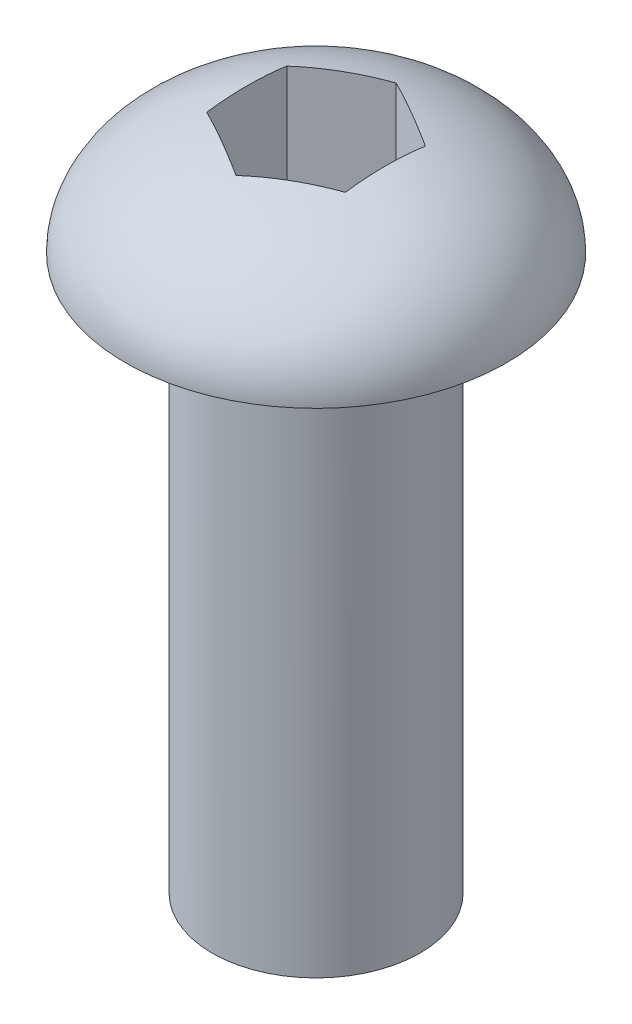
ISO-10303-21;
HEADER;
FILE_DESCRIPTION(('STEP AP214'),'2;1');
FILE_NAME('part.step','',(''),(''),'','','');
FILE_SCHEMA(('AUTOMOTIVE_DESIGN { 1 0 10303 214 1 1 1 1 }'));
ENDSEC;
DATA;
#1=APPLICATION_CONTEXT('core data for automotive mechanical design processes');
#2=APPLICATION_PROTOCOL_DEFINITION('international standard','automotive_design',2000,#1);
#3=PRODUCT_CONTEXT('',#1,'mechanical');
#4=PRODUCT('Part','Part','',(#3));
#5=PRODUCT_RELATED_PRODUCT_CATEGORY('part','',(#4));
#6=PRODUCT_DEFINITION_FORMATION('','',#4);
#7=PRODUCT_DEFINITION_CONTEXT('part definition',#1,'design');
#8=PRODUCT_DEFINITION('design','',#6,#7);
#9=PRODUCT_DEFINITION_SHAPE('','',#8);
#10=(LENGTH_UNIT() NAMED_UNIT(*) SI_UNIT(.MILLI.,.METRE.));
#11=(NAMED_UNIT(*) PLANE_ANGLE_UNIT() SI_UNIT($,.RADIAN.));
#12=(NAMED_UNIT(*) SI_UNIT($,.STERADIAN.) SOLID_ANGLE_UNIT());
#13=UNCERTAINTY_MEASURE_WITH_UNIT(LENGTH_MEASURE(1.E-05),#10,'distance_accuracy_value','');
#14=(GEOMETRIC_REPRESENTATION_CONTEXT(3) GLOBAL_UNCERTAINTY_ASSIGNED_CONTEXT((#13)) GLOBAL_UNIT_ASSIGNED_CONTEXT((#10,
#11,#12)) REPRESENTATION_CONTEXT('',''));
#15=CARTESIAN_POINT('',(0.,0.,0.));
#16=DIRECTION('',(0.,0.,1.));
#17=DIRECTION('',(1.,0.,0.));
#18=AXIS2_PLACEMENT_3D('',#15,#16,#17);
#19=CARTESIAN_POINT('',(0.,8.,0.));
#20=DIRECTION('',(0.,-1.,0.));
#21=DIRECTION('',(0.,0.,-1.));
#22=AXIS2_PLACEMENT_3D('',#19,#20,#21);
#23=CYLINDRICAL_SURFACE('',#22,1.5);
#24=CARTESIAN_POINT('',(0.,0.,0.));
#25=DIRECTION('',(0.,1.,0.));
#26=DIRECTION('',(0.,0.,1.));
#27=AXIS2_PLACEMENT_3D('',#24,#25,#26);
#28=CIRCLE('',#27,1.5);
#29=CARTESIAN_POINT('',(0.,0.,1.5));
#30=VERTEX_POINT('',#29);
#31=EDGE_CURVE('E137',#30,#30,#28,.T.);
#32=ORIENTED_EDGE('',*,*,#31,.T.);
#33=EDGE_LOOP('',(#32));
#34=FACE_BOUND('',#33,.T.);
#35=CARTESIAN_POINT('',(0.,8.,0.));
#36=DIRECTION('',(0.,-1.,0.));
#37=DIRECTION('',(0.,0.,-1.));
#38=AXIS2_PLACEMENT_3D('',#35,#36,#37);
#39=CIRCLE('',#38,1.5);
#40=CARTESIAN_POINT('',(0.,8.,-1.5));
#41=VERTEX_POINT('',#40);
#42=EDGE_CURVE('E122',#41,#41,#39,.T.);
#43=ORIENTED_EDGE('',*,*,#42,.T.);
#44=EDGE_LOOP('',(#43));
#45=FACE_BOUND('',#44,.T.);
#46=ADVANCED_FACE('F32',(#34,#45),#23,.T.);
#47=CARTESIAN_POINT('',(0.,0.,0.));
#48=DIRECTION('',(0.,1.,0.));
#49=DIRECTION('',(0.,0.,1.));
#50=AXIS2_PLACEMENT_3D('',#47,#48,#49);
#51=PLANE('',#50);
#52=ORIENTED_EDGE('',*,*,#31,.F.);
#53=EDGE_LOOP('',(#52));
#54=FACE_BOUND('',#53,.T.);
#55=ADVANCED_FACE('F167',(#54),#51,.F.);
#56=CARTESIAN_POINT('',(0.,8.,0.));
#57=DIRECTION('',(0.,-1.,0.));
#58=DIRECTION('',(0.,0.,-1.));
#59=AXIS2_PLACEMENT_3D('',#56,#57,#58);
#60=PLANE('',#59);
#61=ORIENTED_EDGE('',*,*,#42,.F.);
#62=EDGE_LOOP('',(#61));
#63=FACE_BOUND('',#62,.T.);
#64=CARTESIAN_POINT('',(0.,8.,0.));
#65=DIRECTION('',(0.,-1.,0.));
#66=DIRECTION('',(0.,0.,-1.));
#67=AXIS2_PLACEMENT_3D('',#64,#65,#66);
#68=CIRCLE('',#67,2.75);
#69=CARTESIAN_POINT('',(0.,8.,-2.75));
#70=VERTEX_POINT('',#69);
#71=EDGE_CURVE('E134',#70,#70,#68,.T.);
#72=ORIENTED_EDGE('',*,*,#71,.T.);
#73=EDGE_LOOP('',(#72));
#74=FACE_BOUND('',#73,.T.);
#75=ADVANCED_FACE('F164',(#63,#74),#60,.T.);
#76=CARTESIAN_POINT('',(0.,8.,0.));
#77=DIRECTION('',(1.,0.,0.));
#78=DIRECTION('',(0.,0.,1.));
#79=AXIS2_PLACEMENT_3D('',#76,#77,#78);
#80=ELLIPSE('',#79,2.75,1.7);
#81=TRIMMED_CURVE('',#80,(PARAMETER_VALUE(4.71238898038469)),
(PARAMETER_VALUE(7.85398163397448)),.T.,.PARAMETER.);
#82=CARTESIAN_POINT('',(0.,6.3,0.));
#83=DIRECTION('',(0.,1.,0.));
#84=AXIS1_PLACEMENT('',#82,#83);
#85=SURFACE_OF_REVOLUTION('',#81,#84);
#86=CARTESIAN_POINT('',(0.999999999999999,9.54287663782923,-0.577350269189626));
#87=CARTESIAN_POINT('',(0.946049577360397,9.55178040901843,-0.608498560223494));
#88=CARTESIAN_POINT('',(0.891928815163185,9.55920311374139,-0.639745196846802));
#89=CARTESIAN_POINT('',(0.783442363950719,9.5711314043237,-0.702379878657747));
#90=CARTESIAN_POINT('',(0.729076657342054,9.57563677716719,-0.733767934002944));
#91=CARTESIAN_POINT('',(0.566498932260836,9.5848015833247,-0.827632227342822));
#92=CARTESIAN_POINT('',(0.458078795129906,9.5852278716277,-0.890228622700941));
#93=CARTESIAN_POINT('',(0.291460460989203,9.57716194019643,-0.986425762769003));
#94=CARTESIAN_POINT('',(0.233090136161069,9.57268000990565,-1.02012588552121));
#95=CARTESIAN_POINT('',(0.116413436708374,9.56033752260882,-1.08748920935838));
#96=CARTESIAN_POINT('',(0.0581079930620674,9.55246525127558,-1.1211518729428));
#97=CARTESIAN_POINT('',(0.,9.54287663782923,-1.15470053837925));
#98=B_SPLINE_CURVE_WITH_KNOTS('',3,(#86,#87,#88,#89,#90,#91,#92,#93,#94,#95,#96,#97),
.UNSPECIFIED.,.F.,.F.,(4,2,2,2,2,4),(0.,0.188743111574301,0.37750000311769,0.752478031569036,
0.955055075702624,1.15833775268431),.UNSPECIFIED.);
#99=CARTESIAN_POINT('',(0.999999999999999,9.54287663782923,-0.577350269189626));
#100=VERTEX_POINT('',#99);
#101=CARTESIAN_POINT('',(0.,9.54287663782923,-1.15470053837925));
#102=VERTEX_POINT('',#101);
#103=EDGE_CURVE('E11',#100,#102,#98,.T.);
#104=ORIENTED_EDGE('',*,*,#103,.F.);
#105=CARTESIAN_POINT('',(0.999999999999999,9.54287663782923,0.577350269189626));
#106=CARTESIAN_POINT('',(0.999999999999999,9.55178040901843,0.51505368712189));
#107=CARTESIAN_POINT('',(0.999999999999999,9.55920311374139,0.452560413875274));
#108=CARTESIAN_POINT('',(0.999999999999999,9.5711314043237,0.327291050253385));
#109=CARTESIAN_POINT('',(0.999999999999999,9.57563677716719,0.264514939562991));
#110=CARTESIAN_POINT('',(0.999999999999999,9.5848015833247,0.0767863528832342));
#111=CARTESIAN_POINT('',(0.999999999999998,9.58522787162769,-0.0484064378330033));
#112=CARTESIAN_POINT('',(0.999999999999998,9.57716194019643,-0.240800717969127));
#113=CARTESIAN_POINT('',(0.999999999999999,9.57268000990565,-0.308200963473547));
#114=CARTESIAN_POINT('',(0.999999999999999,9.56033752260882,-0.442927611147888));
#115=CARTESIAN_POINT('',(0.999999999999999,9.55246525127558,-0.510252938316719));
#116=CARTESIAN_POINT('',(0.999999999999999,9.54287663782923,-0.577350269189626));
#117=B_SPLINE_CURVE_WITH_KNOTS('',3,(#105,#106,#107,#108,#109,#110,#111,#112,#113,#114,#115,
#116),.UNSPECIFIED.,.F.,.F.,(4,2,2,2,2,4),(0.,0.188743111574301,0.377500003117691,
0.752478031569037,0.955055075702625,1.15833775268432),.UNSPECIFIED.);
#118=CARTESIAN_POINT('',(0.999999999999999,9.54287663782923,0.577350269189626));
#119=VERTEX_POINT('',#118);
#120=EDGE_CURVE('E47',#119,#100,#117,.T.);
#121=ORIENTED_EDGE('',*,*,#120,.F.);
#122=CARTESIAN_POINT('',(0.,9.54287663782923,1.15470053837925));
#123=CARTESIAN_POINT('',(0.0539504226396023,9.55178040901843,1.12355224734538));
#124=CARTESIAN_POINT('',(0.108071184836815,9.55920311374139,1.09230561072207));
#125=CARTESIAN_POINT('',(0.216557636049281,9.5711314043237,1.02967092891113));
#126=CARTESIAN_POINT('',(0.270923342657945,9.57563677716719,0.998282873565933));
#127=CARTESIAN_POINT('',(0.433501067739164,9.5848015833247,0.904418580226055));
#128=CARTESIAN_POINT('',(0.541921204870094,9.5852278716277,0.841822184867936));
#129=CARTESIAN_POINT('',(0.708539539010797,9.57716194019643,0.745625044799874));
#130=CARTESIAN_POINT('',(0.766909863838931,9.57268000990565,0.711924922047665));
#131=CARTESIAN_POINT('',(0.883586563291626,9.56033752260882,0.644561598210495));
#132=CARTESIAN_POINT('',(0.941892006937932,9.55246525127558,0.61089893462608));
#133=CARTESIAN_POINT('',(0.999999999999998,9.54287663782923,0.577350269189626));
#134=B_SPLINE_CURVE_WITH_KNOTS('',3,(#122,#123,#124,#125,#126,#127,#128,#129,#130,#131,#132,
#133),.UNSPECIFIED.,.F.,.F.,(4,2,2,2,2,4),(0.,0.188743111574301,0.37750000311769,
0.752478031569037,0.955055075702624,1.15833775268431),.UNSPECIFIED.);
#135=CARTESIAN_POINT('',(0.,9.54287663782923,1.15470053837925));
#136=VERTEX_POINT('',#135);
#137=EDGE_CURVE('E196',#136,#119,#134,.T.);
#138=ORIENTED_EDGE('',*,*,#137,.F.);
#139=CARTESIAN_POINT('',(-0.999999999999999,9.54287663782923,0.577350269189626));
#140=CARTESIAN_POINT('',(-0.946049577360398,9.55178040901843,0.608498560223494));
#141=CARTESIAN_POINT('',(-0.891928815163186,9.55920311374139,0.639745196846802));
#142=CARTESIAN_POINT('',(-0.783442363950719,9.5711314043237,0.702379878657747));
#143=CARTESIAN_POINT('',(-0.729076657342055,9.57563677716719,0.733767934002943));
#144=CARTESIAN_POINT('',(-0.566498932260836,9.5848015833247,0.827632227342822));
#145=CARTESIAN_POINT('',(-0.458078795129906,9.5852278716277,0.890228622700941));
#146=CARTESIAN_POINT('',(-0.291460460989203,9.57716194019643,0.986425762769003));
#147=CARTESIAN_POINT('',(-0.233090136161068,9.57268000990565,1.02012588552121));
#148=CARTESIAN_POINT('',(-0.116413436708373,9.56033752260882,1.08748920935838));
#149=CARTESIAN_POINT('',(-0.0581079930620663,9.55246525127558,1.1211518729428));
#150=CARTESIAN_POINT('',(0.,9.54287663782923,1.15470053837925));
#151=B_SPLINE_CURVE_WITH_KNOTS('',3,(#139,#140,#141,#142,#143,#144,#145,#146,#147,#148,#149,
#150),.UNSPECIFIED.,.F.,.F.,(4,2,2,2,2,4),(0.,0.188743111574301,0.377500003117691,
0.752478031569037,0.955055075702625,1.15833775268432),.UNSPECIFIED.);
#152=CARTESIAN_POINT('',(-1.,9.54287663782923,0.577350269189626));
#153=VERTEX_POINT('',#152);
#154=EDGE_CURVE('E193',#153,#136,#151,.T.);
#155=ORIENTED_EDGE('',*,*,#154,.F.);
#156=CARTESIAN_POINT('',(-1.,9.54287663782923,-0.577350269189625));
#157=CARTESIAN_POINT('',(-1.,9.55178040901843,-0.515053687121889));
#158=CARTESIAN_POINT('',(-1.,9.55920311374139,-0.452560413875273));
#159=CARTESIAN_POINT('',(-1.,9.5711314043237,-0.327291050253383));
#160=CARTESIAN_POINT('',(-1.,9.57563677716719,-0.26451493956299));
#161=CARTESIAN_POINT('',(-1.,9.5848015833247,-0.0767863528832327));
#162=CARTESIAN_POINT('',(-1.,9.5852278716277,0.048406437833005));
#163=CARTESIAN_POINT('',(-1.,9.57716194019643,0.240800717969129));
#164=CARTESIAN_POINT('',(-1.,9.57268000990565,0.308200963473547));
#165=CARTESIAN_POINT('',(-0.999999999999999,9.56033752260882,0.442927611147888));
#166=CARTESIAN_POINT('',(-0.999999999999999,9.55246525127558,0.510252938316719));
#167=CARTESIAN_POINT('',(-0.999999999999999,9.54287663782923,0.577350269189625));
#168=B_SPLINE_CURVE_WITH_KNOTS('',3,(#156,#157,#158,#159,#160,#161,#162,#163,#164,#165,#166,
#167),.UNSPECIFIED.,.F.,.F.,(4,2,2,2,2,4),(0.,0.188743111574301,0.377500003117691,
0.752478031569038,0.955055075702625,1.15833775268432),.UNSPECIFIED.);
#169=CARTESIAN_POINT('',(-1.,9.54287663782923,-0.577350269189625));
#170=VERTEX_POINT('',#169);
#171=EDGE_CURVE('E148',#170,#153,#168,.T.);
#172=ORIENTED_EDGE('',*,*,#171,.F.);
#173=CARTESIAN_POINT('',(0.,9.54287663782923,-1.15470053837925));
#174=CARTESIAN_POINT('',(-0.0539504226396015,9.55178040901843,-1.12355224734538));
#175=CARTESIAN_POINT('',(-0.108071184836814,9.55920311374139,-1.09230561072207));
#176=CARTESIAN_POINT('',(-0.21655763604928,9.5711314043237,-1.02967092891113));
#177=CARTESIAN_POINT('',(-0.270923342657945,9.57563677716719,-0.998282873565933));
#178=CARTESIAN_POINT('',(-0.433501067739163,9.5848015833247,-0.904418580226055));
#179=CARTESIAN_POINT('',(-0.541921204870094,9.5852278716277,-0.841822184867937));
#180=CARTESIAN_POINT('',(-0.708539539010797,9.57716194019643,-0.745625044799874));
#181=CARTESIAN_POINT('',(-0.766909863838932,9.57268000990565,-0.711924922047665));
#182=CARTESIAN_POINT('',(-0.883586563291626,9.56033752260882,-0.644561598210494));
#183=CARTESIAN_POINT('',(-0.941892006937932,9.55246525127558,-0.610898934626078));
#184=CARTESIAN_POINT('',(-0.999999999999999,9.54287663782923,-0.577350269189625));
#185=B_SPLINE_CURVE_WITH_KNOTS('',3,(#173,#174,#175,#176,#177,#178,#179,#180,#181,#182,#183,
#184),.UNSPECIFIED.,.F.,.F.,(4,2,2,2,2,4),(0.,0.188743111574301,0.377500003117691,
0.752478031569038,0.955055075702625,1.15833775268432),.UNSPECIFIED.);
#186=EDGE_CURVE('E139',#102,#170,#185,.T.);
#187=ORIENTED_EDGE('',*,*,#186,.F.);
#188=EDGE_LOOP('',(#104,#121,#138,#155,#172,#187));
#189=FACE_BOUND('',#188,.T.);
#190=ORIENTED_EDGE('',*,*,#71,.F.);
#191=EDGE_LOOP('',(#190));
#192=FACE_BOUND('',#191,.T.);
#193=ADVANCED_FACE('F34',(#189,#192),#85,.F.);
#194=CARTESIAN_POINT('',(0.999999999999999,7.7,-0.577350269189626));
#195=DIRECTION('',(0.5,0.,-0.866025403784439));
#196=DIRECTION('',(-0.866025403784439,0.,-0.5));
#197=AXIS2_PLACEMENT_3D('',#194,#195,#196);
#198=PLANE('',#197);
#199=ORIENTED_EDGE('',*,*,#103,.T.);
#200=DIRECTION('',(0.,1.,0.));
#201=VECTOR('',#200,1.);
#202=CARTESIAN_POINT('',(0.,7.7,-1.15470053837925));
#203=LINE('',#202,#201);
#204=CARTESIAN_POINT('',(0.,7.7,-1.15470053837925));
#205=VERTEX_POINT('',#204);
#206=EDGE_CURVE('E54',#205,#102,#203,.T.);
#207=ORIENTED_EDGE('',*,*,#206,.F.);
#208=DIRECTION('',(-0.866025403784439,0.,-0.5));
#209=VECTOR('',#208,1.);
#210=CARTESIAN_POINT('',(0.999999999999999,7.7,-0.577350269189626));
#211=LINE('',#210,#209);
#212=CARTESIAN_POINT('',(0.999999999999999,7.7,-0.577350269189626));
#213=VERTEX_POINT('',#212);
#214=EDGE_CURVE('E92',#213,#205,#211,.T.);
#215=ORIENTED_EDGE('',*,*,#214,.F.);
#216=DIRECTION('',(0.,1.,0.));
#217=VECTOR('',#216,1.);
#218=CARTESIAN_POINT('',(0.999999999999999,7.7,-0.577350269189626));
#219=LINE('',#218,#217);
#220=EDGE_CURVE('E120',#213,#100,#219,.T.);
#221=ORIENTED_EDGE('',*,*,#220,.T.);
#222=EDGE_LOOP('',(#199,#207,#215,#221));
#223=FACE_BOUND('',#222,.T.);
#224=ADVANCED_FACE('F90',(#223),#198,.F.);
#225=CARTESIAN_POINT('',(0.999999999999999,7.7,0.577350269189626));
#226=DIRECTION('',(1.,0.,0.));
#227=DIRECTION('',(0.,0.,-1.));
#228=AXIS2_PLACEMENT_3D('',#225,#226,#227);
#229=PLANE('',#228);
#230=ORIENTED_EDGE('',*,*,#120,.T.);
#231=ORIENTED_EDGE('',*,*,#220,.F.);
#232=DIRECTION('',(0.,0.,-1.));
#233=VECTOR('',#232,1.);
#234=CARTESIAN_POINT('',(0.999999999999999,7.7,0.577350269189626));
#235=LINE('',#234,#233);
#236=CARTESIAN_POINT('',(0.999999999999999,7.7,0.577350269189626));
#237=VERTEX_POINT('',#236);
#238=EDGE_CURVE('E97',#237,#213,#235,.T.);
#239=ORIENTED_EDGE('',*,*,#238,.F.);
#240=DIRECTION('',(0.,1.,0.));
#241=VECTOR('',#240,1.);
#242=CARTESIAN_POINT('',(0.999999999999999,7.7,0.577350269189626));
#243=LINE('',#242,#241);
#244=EDGE_CURVE('E123',#237,#119,#243,.T.);
#245=ORIENTED_EDGE('',*,*,#244,.T.);
#246=EDGE_LOOP('',(#230,#231,#239,#245));
#247=FACE_BOUND('',#246,.T.);
#248=ADVANCED_FACE('F163',(#247),#229,.F.);
#249=CARTESIAN_POINT('',(0.,7.7,1.15470053837925));
#250=DIRECTION('',(0.5,0.,0.866025403784439));
#251=DIRECTION('',(0.866025403784439,0.,-0.5));
#252=AXIS2_PLACEMENT_3D('',#249,#250,#251);
#253=PLANE('',#252);
#254=ORIENTED_EDGE('',*,*,#137,.T.);
#255=ORIENTED_EDGE('',*,*,#244,.F.);
#256=DIRECTION('',(0.866025403784439,0.,-0.5));
#257=VECTOR('',#256,1.);
#258=CARTESIAN_POINT('',(0.,7.7,1.15470053837925));
#259=LINE('',#258,#257);
#260=CARTESIAN_POINT('',(0.,7.7,1.15470053837925));
#261=VERTEX_POINT('',#260);
#262=EDGE_CURVE('E117',#261,#237,#259,.T.);
#263=ORIENTED_EDGE('',*,*,#262,.F.);
#264=DIRECTION('',(0.,1.,0.));
#265=VECTOR('',#264,1.);
#266=CARTESIAN_POINT('',(0.,7.7,1.15470053837925));
#267=LINE('',#266,#265);
#268=EDGE_CURVE('E125',#261,#136,#267,.T.);
#269=ORIENTED_EDGE('',*,*,#268,.T.);
#270=EDGE_LOOP('',(#254,#255,#263,#269));
#271=FACE_BOUND('',#270,.T.);
#272=ADVANCED_FACE('F195',(#271),#253,.F.);
#273=CARTESIAN_POINT('',(-1.,7.7,0.577350269189626));
#274=DIRECTION('',(-0.5,0.,0.866025403784439));
#275=DIRECTION('',(0.866025403784439,0.,0.5));
#276=AXIS2_PLACEMENT_3D('',#273,#274,#275);
#277=PLANE('',#276);
#278=ORIENTED_EDGE('',*,*,#154,.T.);
#279=ORIENTED_EDGE('',*,*,#268,.F.);
#280=DIRECTION('',(0.866025403784439,0.,0.5));
#281=VECTOR('',#280,1.);
#282=CARTESIAN_POINT('',(-1.,7.7,0.577350269189626));
#283=LINE('',#282,#281);
#284=CARTESIAN_POINT('',(-1.,7.7,0.577350269189626));
#285=VERTEX_POINT('',#284);
#286=EDGE_CURVE('E114',#285,#261,#283,.T.);
#287=ORIENTED_EDGE('',*,*,#286,.F.);
#288=DIRECTION('',(0.,1.,0.));
#289=VECTOR('',#288,1.);
#290=CARTESIAN_POINT('',(-1.,7.7,0.577350269189626));
#291=LINE('',#290,#289);
#292=EDGE_CURVE('E128',#285,#153,#291,.T.);
#293=ORIENTED_EDGE('',*,*,#292,.T.);
#294=EDGE_LOOP('',(#278,#279,#287,#293));
#295=FACE_BOUND('',#294,.T.);
#296=ADVANCED_FACE('F192',(#295),#277,.F.);
#297=CARTESIAN_POINT('',(-1.,7.7,-0.577350269189625));
#298=DIRECTION('',(-1.,0.,0.));
#299=DIRECTION('',(0.,0.,1.));
#300=AXIS2_PLACEMENT_3D('',#297,#298,#299);
#301=PLANE('',#300);
#302=ORIENTED_EDGE('',*,*,#171,.T.);
#303=ORIENTED_EDGE('',*,*,#292,.F.);
#304=DIRECTION('',(0.,0.,1.));
#305=VECTOR('',#304,1.);
#306=CARTESIAN_POINT('',(-1.,7.7,-0.577350269189625));
#307=LINE('',#306,#305);
#308=CARTESIAN_POINT('',(-1.,7.7,-0.577350269189625));
#309=VERTEX_POINT('',#308);
#310=EDGE_CURVE('E106',#309,#285,#307,.T.);
#311=ORIENTED_EDGE('',*,*,#310,.F.);
#312=DIRECTION('',(0.,1.,0.));
#313=VECTOR('',#312,1.);
#314=CARTESIAN_POINT('',(-1.,7.7,-0.577350269189625));
#315=LINE('',#314,#313);
#316=EDGE_CURVE('E96',#309,#170,#315,.T.);
#317=ORIENTED_EDGE('',*,*,#316,.T.);
#318=EDGE_LOOP('',(#302,#303,#311,#317));
#319=FACE_BOUND('',#318,.T.);
#320=ADVANCED_FACE('F157',(#319),#301,.F.);
#321=CARTESIAN_POINT('',(0.,7.7,-1.15470053837925));
#322=DIRECTION('',(-0.5,0.,-0.866025403784439));
#323=DIRECTION('',(-0.866025403784438,0.,0.5));
#324=AXIS2_PLACEMENT_3D('',#321,#322,#323);
#325=PLANE('',#324);
#326=ORIENTED_EDGE('',*,*,#186,.T.);
#327=ORIENTED_EDGE('',*,*,#316,.F.);
#328=DIRECTION('',(-0.866025403784438,0.,0.5));
#329=VECTOR('',#328,1.);
#330=CARTESIAN_POINT('',(0.,7.7,-1.15470053837925));
#331=LINE('',#330,#329);
#332=EDGE_CURVE('E100',#205,#309,#331,.T.);
#333=ORIENTED_EDGE('',*,*,#332,.F.);
#334=ORIENTED_EDGE('',*,*,#206,.T.);
#335=EDGE_LOOP('',(#326,#327,#333,#334));
#336=FACE_BOUND('',#335,.T.);
#337=ADVANCED_FACE('F101',(#336),#325,.F.);
#338=CARTESIAN_POINT('',(0.,7.7,0.));
#339=DIRECTION('',(0.,1.,0.));
#340=DIRECTION('',(0.,0.,1.));
#341=AXIS2_PLACEMENT_3D('',#338,#339,#340);
#342=PLANE('',#341);
#343=ORIENTED_EDGE('',*,*,#214,.T.);
#344=ORIENTED_EDGE('',*,*,#332,.T.);
#345=ORIENTED_EDGE('',*,*,#310,.T.);
#346=ORIENTED_EDGE('',*,*,#286,.T.);
#347=ORIENTED_EDGE('',*,*,#262,.T.);
#348=ORIENTED_EDGE('',*,*,#238,.T.);
#349=EDGE_LOOP('',(#343,#344,#345,#346,#347,#348));
#350=FACE_BOUND('',#349,.T.);
#351=ADVANCED_FACE('F108',(#350),#342,.T.);
#352=CLOSED_SHELL('',(#46,#55,#75,#193,#224,#248,#272,#296,#320,#337,#351));
#353=MANIFOLD_SOLID_BREP('B2',#352);
#354=ADVANCED_BREP_SHAPE_REPRESENTATION('',(#18,#353),#14);
#355=SHAPE_DEFINITION_REPRESENTATION(#9,#354);
ENDSEC;
END-ISO-10303-21;
